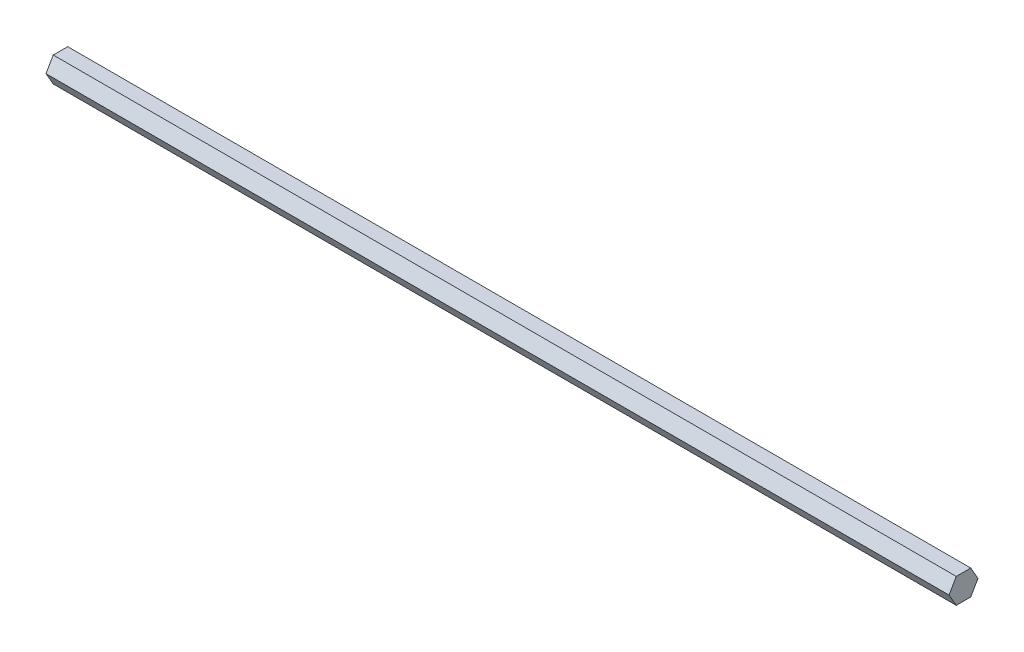
ISO-10303-21;
HEADER;
FILE_DESCRIPTION(('STEP AP214'),'2;1');
FILE_NAME('part.step','',(''),(''),'','','');
FILE_SCHEMA(('AUTOMOTIVE_DESIGN { 1 0 10303 214 1 1 1 1 }'));
ENDSEC;
DATA;
#1=APPLICATION_CONTEXT('core data for automotive mechanical design processes');
#2=APPLICATION_PROTOCOL_DEFINITION('international standard','automotive_design',2000,#1);
#3=PRODUCT_CONTEXT('',#1,'mechanical');
#4=PRODUCT('Part','Part','',(#3));
#5=PRODUCT_RELATED_PRODUCT_CATEGORY('part','',(#4));
#6=PRODUCT_DEFINITION_FORMATION('','',#4);
#7=PRODUCT_DEFINITION_CONTEXT('part definition',#1,'design');
#8=PRODUCT_DEFINITION('design','',#6,#7);
#9=PRODUCT_DEFINITION_SHAPE('','',#8);
#10=(LENGTH_UNIT() NAMED_UNIT(*) SI_UNIT(.MILLI.,.METRE.));
#11=(NAMED_UNIT(*) PLANE_ANGLE_UNIT() SI_UNIT($,.RADIAN.));
#12=(NAMED_UNIT(*) SI_UNIT($,.STERADIAN.) SOLID_ANGLE_UNIT());
#13=UNCERTAINTY_MEASURE_WITH_UNIT(LENGTH_MEASURE(1.E-05),#10,'distance_accuracy_value','');
#14=(GEOMETRIC_REPRESENTATION_CONTEXT(3) GLOBAL_UNCERTAINTY_ASSIGNED_CONTEXT((#13)) GLOBAL_UNIT_ASSIGNED_CONTEXT((#10,
#11,#12)) REPRESENTATION_CONTEXT('',''));
#15=CARTESIAN_POINT('',(0.,0.,0.));
#16=DIRECTION('',(0.,0.,1.));
#17=DIRECTION('',(1.,0.,0.));
#18=AXIS2_PLACEMENT_3D('',#15,#16,#17);
#19=CARTESIAN_POINT('',(457.2,-6.34999999999996,-3.6661742093542));
#20=DIRECTION('',(0.,0.499999999999995,0.866025403784442));
#21=DIRECTION('',(0.,-0.866025403784442,0.499999999999995));
#22=AXIS2_PLACEMENT_3D('',#19,#20,#21);
#23=PLANE('',#22);
#24=DIRECTION('',(0.,0.866025403784441,-0.499999999999995));
#25=VECTOR('',#24,1.);
#26=CARTESIAN_POINT('',(0.,-6.34999999999996,-3.6661742093542));
#27=LINE('',#26,#25);
#28=CARTESIAN_POINT('',(0.,-6.34999999999996,-3.6661742093542));
#29=VERTEX_POINT('',#28);
#30=CARTESIAN_POINT('',(0.,0.,-7.33234841870825));
#31=VERTEX_POINT('',#30);
#32=EDGE_CURVE('E124',#29,#31,#27,.T.);
#33=ORIENTED_EDGE('',*,*,#32,.T.);
#34=DIRECTION('',(-1.,0.,0.));
#35=VECTOR('',#34,1.);
#36=CARTESIAN_POINT('',(457.2,0.,-7.33234841870825));
#37=LINE('',#36,#35);
#38=CARTESIAN_POINT('',(457.2,0.,-7.33234841870825));
#39=VERTEX_POINT('',#38);
#40=EDGE_CURVE('E11',#39,#31,#37,.T.);
#41=ORIENTED_EDGE('',*,*,#40,.F.);
#42=DIRECTION('',(0.,0.866025403784441,-0.499999999999995));
#43=VECTOR('',#42,1.);
#44=CARTESIAN_POINT('',(457.2,-6.34999999999996,-3.6661742093542));
#45=LINE('',#44,#43);
#46=CARTESIAN_POINT('',(457.2,-6.34999999999996,-3.6661742093542));
#47=VERTEX_POINT('',#46);
#48=EDGE_CURVE('E134',#47,#39,#45,.T.);
#49=ORIENTED_EDGE('',*,*,#48,.F.);
#50=DIRECTION('',(-1.,0.,0.));
#51=VECTOR('',#50,1.);
#52=CARTESIAN_POINT('',(457.2,-6.34999999999996,-3.6661742093542));
#53=LINE('',#52,#51);
#54=EDGE_CURVE('E120',#47,#29,#53,.T.);
#55=ORIENTED_EDGE('',*,*,#54,.T.);
#56=EDGE_LOOP('',(#33,#41,#49,#55));
#57=FACE_BOUND('',#56,.T.);
#58=ADVANCED_FACE('F40',(#57),#23,.F.);
#59=CARTESIAN_POINT('',(457.2,0.,-7.33234841870825));
#60=DIRECTION('',(0.,-0.500000000000001,0.866025403784438));
#61=DIRECTION('',(0.,-0.866025403784438,-0.500000000000001));
#62=AXIS2_PLACEMENT_3D('',#59,#60,#61);
#63=PLANE('',#62);
#64=DIRECTION('',(0.,0.866025403784438,0.500000000000001));
#65=VECTOR('',#64,1.);
#66=CARTESIAN_POINT('',(0.,0.,-7.33234841870825));
#67=LINE('',#66,#65);
#68=CARTESIAN_POINT('',(0.,6.35000000000001,-3.66617420935411));
#69=VERTEX_POINT('',#68);
#70=EDGE_CURVE('E127',#31,#69,#67,.T.);
#71=ORIENTED_EDGE('',*,*,#70,.T.);
#72=DIRECTION('',(-1.,0.,0.));
#73=VECTOR('',#72,1.);
#74=CARTESIAN_POINT('',(457.2,6.35000000000001,-3.66617420935411));
#75=LINE('',#74,#73);
#76=CARTESIAN_POINT('',(457.2,6.35000000000001,-3.66617420935411));
#77=VERTEX_POINT('',#76);
#78=EDGE_CURVE('E48',#77,#69,#75,.T.);
#79=ORIENTED_EDGE('',*,*,#78,.F.);
#80=DIRECTION('',(0.,0.866025403784438,0.500000000000001));
#81=VECTOR('',#80,1.);
#82=CARTESIAN_POINT('',(457.2,0.,-7.33234841870825));
#83=LINE('',#82,#81);
#84=EDGE_CURVE('E93',#39,#77,#83,.T.);
#85=ORIENTED_EDGE('',*,*,#84,.F.);
#86=ORIENTED_EDGE('',*,*,#40,.T.);
#87=EDGE_LOOP('',(#71,#79,#85,#86));
#88=FACE_BOUND('',#87,.T.);
#89=ADVANCED_FACE('F158',(#88),#63,.F.);
#90=CARTESIAN_POINT('',(457.2,6.35000000000001,-3.66617420935411));
#91=DIRECTION('',(0.,-1.,0.));
#92=DIRECTION('',(0.,0.,-1.));
#93=AXIS2_PLACEMENT_3D('',#90,#91,#92);
#94=PLANE('',#93);
#95=DIRECTION('',(0.,0.,1.));
#96=VECTOR('',#95,1.);
#97=CARTESIAN_POINT('',(0.,6.35000000000001,-3.66617420935411));
#98=LINE('',#97,#96);
#99=CARTESIAN_POINT('',(0.,6.34999999999999,3.66617420935415));
#100=VERTEX_POINT('',#99);
#101=EDGE_CURVE('E129',#69,#100,#98,.T.);
#102=ORIENTED_EDGE('',*,*,#101,.T.);
#103=DIRECTION('',(-1.,0.,0.));
#104=VECTOR('',#103,1.);
#105=CARTESIAN_POINT('',(457.2,6.34999999999999,3.66617420935415));
#106=LINE('',#105,#104);
#107=CARTESIAN_POINT('',(457.2,6.34999999999999,3.66617420935415));
#108=VERTEX_POINT('',#107);
#109=EDGE_CURVE('E115',#108,#100,#106,.T.);
#110=ORIENTED_EDGE('',*,*,#109,.F.);
#111=DIRECTION('',(0.,0.,1.));
#112=VECTOR('',#111,1.);
#113=CARTESIAN_POINT('',(457.2,6.35000000000001,-3.66617420935411));
#114=LINE('',#113,#112);
#115=EDGE_CURVE('E106',#77,#108,#114,.T.);
#116=ORIENTED_EDGE('',*,*,#115,.F.);
#117=ORIENTED_EDGE('',*,*,#78,.T.);
#118=EDGE_LOOP('',(#102,#110,#116,#117));
#119=FACE_BOUND('',#118,.T.);
#120=ADVANCED_FACE('F140',(#119),#94,.F.);
#121=CARTESIAN_POINT('',(457.2,6.34999999999999,3.66617420935415));
#122=DIRECTION('',(0.,-0.499999999999995,-0.866025403784442));
#123=DIRECTION('',(0.,0.866025403784442,-0.499999999999995));
#124=AXIS2_PLACEMENT_3D('',#121,#122,#123);
#125=PLANE('',#124);
#126=DIRECTION('',(0.,-0.866025403784442,0.499999999999995));
#127=VECTOR('',#126,1.);
#128=CARTESIAN_POINT('',(0.,6.34999999999999,3.66617420935415));
#129=LINE('',#128,#127);
#130=CARTESIAN_POINT('',(0.,0.,7.33234841870825));
#131=VERTEX_POINT('',#130);
#132=EDGE_CURVE('E114',#100,#131,#129,.T.);
#133=ORIENTED_EDGE('',*,*,#132,.T.);
#134=DIRECTION('',(-1.,0.,0.));
#135=VECTOR('',#134,1.);
#136=CARTESIAN_POINT('',(457.2,0.,7.33234841870825));
#137=LINE('',#136,#135);
#138=CARTESIAN_POINT('',(457.2,0.,7.33234841870825));
#139=VERTEX_POINT('',#138);
#140=EDGE_CURVE('E111',#139,#131,#137,.T.);
#141=ORIENTED_EDGE('',*,*,#140,.F.);
#142=DIRECTION('',(0.,-0.866025403784442,0.499999999999995));
#143=VECTOR('',#142,1.);
#144=CARTESIAN_POINT('',(457.2,6.34999999999999,3.66617420935415));
#145=LINE('',#144,#143);
#146=EDGE_CURVE('E100',#108,#139,#145,.T.);
#147=ORIENTED_EDGE('',*,*,#146,.F.);
#148=ORIENTED_EDGE('',*,*,#109,.T.);
#149=EDGE_LOOP('',(#133,#141,#147,#148));
#150=FACE_BOUND('',#149,.T.);
#151=ADVANCED_FACE('F112',(#150),#125,.F.);
#152=CARTESIAN_POINT('',(457.2,0.,7.33234841870825));
#153=DIRECTION('',(0.,0.500000000000007,-0.866025403784435));
#154=DIRECTION('',(0.,0.866025403784434,0.500000000000007));
#155=AXIS2_PLACEMENT_3D('',#152,#153,#154);
#156=PLANE('',#155);
#157=DIRECTION('',(0.,-0.866025403784434,-0.500000000000007));
#158=VECTOR('',#157,1.);
#159=CARTESIAN_POINT('',(0.,0.,7.33234841870825));
#160=LINE('',#159,#158);
#161=CARTESIAN_POINT('',(0.,-6.35000000000004,3.66617420935407));
#162=VERTEX_POINT('',#161);
#163=EDGE_CURVE('E79',#131,#162,#160,.T.);
#164=ORIENTED_EDGE('',*,*,#163,.T.);
#165=DIRECTION('',(-1.,0.,0.));
#166=VECTOR('',#165,1.);
#167=CARTESIAN_POINT('',(457.2,-6.35000000000004,3.66617420935407));
#168=LINE('',#167,#166);
#169=CARTESIAN_POINT('',(457.2,-6.35000000000004,3.66617420935407));
#170=VERTEX_POINT('',#169);
#171=EDGE_CURVE('E116',#170,#162,#168,.T.);
#172=ORIENTED_EDGE('',*,*,#171,.F.);
#173=DIRECTION('',(0.,-0.866025403784434,-0.500000000000007));
#174=VECTOR('',#173,1.);
#175=CARTESIAN_POINT('',(457.2,0.,7.33234841870825));
#176=LINE('',#175,#174);
#177=EDGE_CURVE('E104',#139,#170,#176,.T.);
#178=ORIENTED_EDGE('',*,*,#177,.F.);
#179=ORIENTED_EDGE('',*,*,#140,.T.);
#180=EDGE_LOOP('',(#164,#172,#178,#179));
#181=FACE_BOUND('',#180,.T.);
#182=ADVANCED_FACE('F118',(#181),#156,.F.);
#183=CARTESIAN_POINT('',(457.2,-6.35000000000004,3.66617420935407));
#184=DIRECTION('',(0.,1.,0.));
#185=DIRECTION('',(0.,0.,1.));
#186=AXIS2_PLACEMENT_3D('',#183,#184,#185);
#187=PLANE('',#186);
#188=DIRECTION('',(0.,0.,-1.));
#189=VECTOR('',#188,1.);
#190=CARTESIAN_POINT('',(0.,-6.35000000000004,3.66617420935407));
#191=LINE('',#190,#189);
#192=EDGE_CURVE('E85',#162,#29,#191,.T.);
#193=ORIENTED_EDGE('',*,*,#192,.T.);
#194=ORIENTED_EDGE('',*,*,#54,.F.);
#195=DIRECTION('',(0.,0.,-1.));
#196=VECTOR('',#195,1.);
#197=CARTESIAN_POINT('',(457.2,-6.35000000000004,3.66617420935407));
#198=LINE('',#197,#196);
#199=EDGE_CURVE('E56',#170,#47,#198,.T.);
#200=ORIENTED_EDGE('',*,*,#199,.F.);
#201=ORIENTED_EDGE('',*,*,#171,.T.);
#202=EDGE_LOOP('',(#193,#194,#200,#201));
#203=FACE_BOUND('',#202,.T.);
#204=ADVANCED_FACE('F147',(#203),#187,.F.);
#205=CARTESIAN_POINT('',(457.2,0.,0.));
#206=DIRECTION('',(1.,0.,0.));
#207=DIRECTION('',(0.,0.,-1.));
#208=AXIS2_PLACEMENT_3D('',#205,#206,#207);
#209=PLANE('',#208);
#210=ORIENTED_EDGE('',*,*,#48,.T.);
#211=ORIENTED_EDGE('',*,*,#84,.T.);
#212=ORIENTED_EDGE('',*,*,#115,.T.);
#213=ORIENTED_EDGE('',*,*,#146,.T.);
#214=ORIENTED_EDGE('',*,*,#177,.T.);
#215=ORIENTED_EDGE('',*,*,#199,.T.);
#216=EDGE_LOOP('',(#210,#211,#212,#213,#214,#215));
#217=FACE_BOUND('',#216,.T.);
#218=ADVANCED_FACE('F102',(#217),#209,.T.);
#219=CARTESIAN_POINT('',(0.,0.,0.));
#220=DIRECTION('',(1.,0.,0.));
#221=DIRECTION('',(0.,0.,-1.));
#222=AXIS2_PLACEMENT_3D('',#219,#220,#221);
#223=PLANE('',#222);
#224=ORIENTED_EDGE('',*,*,#32,.F.);
#225=ORIENTED_EDGE('',*,*,#192,.F.);
#226=ORIENTED_EDGE('',*,*,#163,.F.);
#227=ORIENTED_EDGE('',*,*,#132,.F.);
#228=ORIENTED_EDGE('',*,*,#101,.F.);
#229=ORIENTED_EDGE('',*,*,#70,.F.);
#230=EDGE_LOOP('',(#224,#225,#226,#227,#228,#229));
#231=FACE_BOUND('',#230,.T.);
#232=ADVANCED_FACE('F143',(#231),#223,.F.);
#233=CLOSED_SHELL('',(#58,#89,#120,#151,#182,#204,#218,#232));
#234=MANIFOLD_SOLID_BREP('B2',#233);
#235=ADVANCED_BREP_SHAPE_REPRESENTATION('',(#18,#234),#14);
#236=SHAPE_DEFINITION_REPRESENTATION(#9,#235);
ENDSEC;
END-ISO-10303-21;
